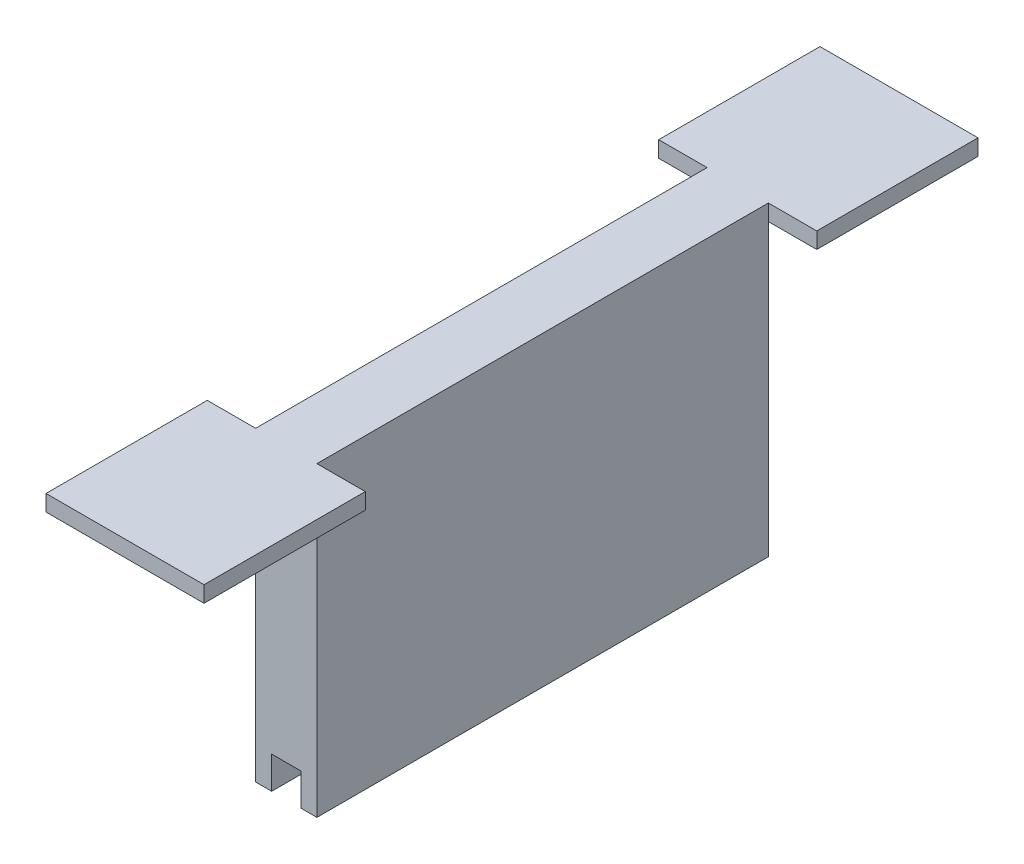
ISO-10303-21;
HEADER;
FILE_DESCRIPTION(('STEP AP214'),'2;1');
FILE_NAME('part.step','',(''),(''),'','','');
FILE_SCHEMA(('AUTOMOTIVE_DESIGN { 1 0 10303 214 1 1 1 1 }'));
ENDSEC;
DATA;
#1=APPLICATION_CONTEXT('core data for automotive mechanical design processes');
#2=APPLICATION_PROTOCOL_DEFINITION('international standard','automotive_design',2000,#1);
#3=PRODUCT_CONTEXT('',#1,'mechanical');
#4=PRODUCT('Part','Part','',(#3));
#5=PRODUCT_RELATED_PRODUCT_CATEGORY('part','',(#4));
#6=PRODUCT_DEFINITION_FORMATION('','',#4);
#7=PRODUCT_DEFINITION_CONTEXT('part definition',#1,'design');
#8=PRODUCT_DEFINITION('design','',#6,#7);
#9=PRODUCT_DEFINITION_SHAPE('','',#8);
#10=(LENGTH_UNIT() NAMED_UNIT(*) SI_UNIT(.MILLI.,.METRE.));
#11=(NAMED_UNIT(*) PLANE_ANGLE_UNIT() SI_UNIT($,.RADIAN.));
#12=(NAMED_UNIT(*) SI_UNIT($,.STERADIAN.) SOLID_ANGLE_UNIT());
#13=UNCERTAINTY_MEASURE_WITH_UNIT(LENGTH_MEASURE(1.E-05),#10,'distance_accuracy_value','');
#14=(GEOMETRIC_REPRESENTATION_CONTEXT(3) GLOBAL_UNCERTAINTY_ASSIGNED_CONTEXT((#13)) GLOBAL_UNIT_ASSIGNED_CONTEXT((#10,
#11,#12)) REPRESENTATION_CONTEXT('',''));
#15=CARTESIAN_POINT('',(0.,0.,0.));
#16=DIRECTION('',(0.,0.,1.));
#17=DIRECTION('',(1.,0.,0.));
#18=AXIS2_PLACEMENT_3D('',#15,#16,#17);
#19=CARTESIAN_POINT('',(3.8,0.,28.));
#20=DIRECTION('',(-1.,0.,0.));
#21=DIRECTION('',(0.,-1.,0.));
#22=AXIS2_PLACEMENT_3D('',#19,#20,#21);
#23=PLANE('',#22);
#24=DIRECTION('',(0.,1.,0.));
#25=VECTOR('',#24,1.);
#26=CARTESIAN_POINT('',(3.8,18.,28.));
#27=LINE('',#26,#25);
#28=CARTESIAN_POINT('',(3.8,18.,28.));
#29=VERTEX_POINT('',#28);
#30=CARTESIAN_POINT('',(3.8,19.,28.));
#31=VERTEX_POINT('',#30);
#32=EDGE_CURVE('E184',#29,#31,#27,.T.);
#33=ORIENTED_EDGE('',*,*,#32,.F.);
#34=DIRECTION('',(0.,1.,0.));
#35=VECTOR('',#34,1.);
#36=CARTESIAN_POINT('',(3.8,0.,28.));
#37=LINE('',#36,#35);
#38=CARTESIAN_POINT('',(3.8,0.,28.));
#39=VERTEX_POINT('',#38);
#40=EDGE_CURVE('E311',#39,#29,#37,.T.);
#41=ORIENTED_EDGE('',*,*,#40,.F.);
#42=DIRECTION('',(0.,0.,-1.));
#43=VECTOR('',#42,1.);
#44=CARTESIAN_POINT('',(3.8,0.,28.));
#45=LINE('',#44,#43);
#46=CARTESIAN_POINT('',(3.8,0.,0.));
#47=VERTEX_POINT('',#46);
#48=EDGE_CURVE('E353',#39,#47,#45,.T.);
#49=ORIENTED_EDGE('',*,*,#48,.T.);
#50=DIRECTION('',(0.,1.,0.));
#51=VECTOR('',#50,1.);
#52=CARTESIAN_POINT('',(3.8,0.,0.));
#53=LINE('',#52,#51);
#54=CARTESIAN_POINT('',(3.8,18.,0.));
#55=VERTEX_POINT('',#54);
#56=EDGE_CURVE('E339',#47,#55,#53,.T.);
#57=ORIENTED_EDGE('',*,*,#56,.T.);
#58=DIRECTION('',(0.,1.,0.));
#59=VECTOR('',#58,1.);
#60=CARTESIAN_POINT('',(3.8,18.,0.));
#61=LINE('',#60,#59);
#62=CARTESIAN_POINT('',(3.8,19.,0.));
#63=VERTEX_POINT('',#62);
#64=EDGE_CURVE('E246',#55,#63,#61,.T.);
#65=ORIENTED_EDGE('',*,*,#64,.T.);
#66=DIRECTION('',(0.,0.,-1.));
#67=VECTOR('',#66,1.);
#68=CARTESIAN_POINT('',(3.8,19.,28.));
#69=LINE('',#68,#67);
#70=EDGE_CURVE('E55',#31,#63,#69,.T.);
#71=ORIENTED_EDGE('',*,*,#70,.F.);
#72=EDGE_LOOP('',(#33,#41,#49,#57,#65,#71));
#73=FACE_BOUND('',#72,.T.);
#74=ADVANCED_FACE('F39',(#73),#23,.F.);
#75=CARTESIAN_POINT('',(0.,0.,28.));
#76=DIRECTION('',(-1.,0.,0.));
#77=DIRECTION('',(0.,0.,1.));
#78=AXIS2_PLACEMENT_3D('',#75,#76,#77);
#79=PLANE('',#78);
#80=DIRECTION('',(0.,1.,0.));
#81=VECTOR('',#80,1.);
#82=CARTESIAN_POINT('',(0.,0.,28.));
#83=LINE('',#82,#81);
#84=CARTESIAN_POINT('',(0.,0.,28.));
#85=VERTEX_POINT('',#84);
#86=CARTESIAN_POINT('',(0.,18.,28.));
#87=VERTEX_POINT('',#86);
#88=EDGE_CURVE('E315',#85,#87,#83,.T.);
#89=ORIENTED_EDGE('',*,*,#88,.T.);
#90=DIRECTION('',(0.,-1.,0.));
#91=VECTOR('',#90,1.);
#92=CARTESIAN_POINT('',(0.,18.,28.));
#93=LINE('',#92,#91);
#94=CARTESIAN_POINT('',(0.,19.,28.));
#95=VERTEX_POINT('',#94);
#96=EDGE_CURVE('E188',#95,#87,#93,.T.);
#97=ORIENTED_EDGE('',*,*,#96,.F.);
#98=DIRECTION('',(0.,0.,-1.));
#99=VECTOR('',#98,1.);
#100=CARTESIAN_POINT('',(0.,19.,28.));
#101=LINE('',#100,#99);
#102=CARTESIAN_POINT('',(0.,19.,0.));
#103=VERTEX_POINT('',#102);
#104=EDGE_CURVE('E348',#95,#103,#101,.T.);
#105=ORIENTED_EDGE('',*,*,#104,.T.);
#106=DIRECTION('',(0.,1.,0.));
#107=VECTOR('',#106,1.);
#108=CARTESIAN_POINT('',(0.,18.,0.));
#109=LINE('',#108,#107);
#110=CARTESIAN_POINT('',(0.,18.,0.));
#111=VERTEX_POINT('',#110);
#112=EDGE_CURVE('E219',#111,#103,#109,.T.);
#113=ORIENTED_EDGE('',*,*,#112,.F.);
#114=DIRECTION('',(0.,1.,0.));
#115=VECTOR('',#114,1.);
#116=CARTESIAN_POINT('',(0.,0.,0.));
#117=LINE('',#116,#115);
#118=CARTESIAN_POINT('',(0.,0.,0.));
#119=VERTEX_POINT('',#118);
#120=EDGE_CURVE('E296',#119,#111,#117,.T.);
#121=ORIENTED_EDGE('',*,*,#120,.F.);
#122=DIRECTION('',(0.,0.,-1.));
#123=VECTOR('',#122,1.);
#124=CARTESIAN_POINT('',(0.,0.,28.));
#125=LINE('',#124,#123);
#126=EDGE_CURVE('E319',#85,#119,#125,.T.);
#127=ORIENTED_EDGE('',*,*,#126,.F.);
#128=EDGE_LOOP('',(#89,#97,#105,#113,#121,#127));
#129=FACE_BOUND('',#128,.T.);
#130=ADVANCED_FACE('F389',(#129),#79,.T.);
#131=CARTESIAN_POINT('',(0.,0.,0.));
#132=DIRECTION('',(0.,0.,1.));
#133=DIRECTION('',(1.,0.,0.));
#134=AXIS2_PLACEMENT_3D('',#131,#132,#133);
#135=PLANE('',#134);
#136=DIRECTION('',(-1.,0.,0.));
#137=VECTOR('',#136,1.);
#138=CARTESIAN_POINT('',(3.8,18.,0.));
#139=LINE('',#138,#137);
#140=EDGE_CURVE('E269',#55,#111,#139,.T.);
#141=ORIENTED_EDGE('',*,*,#140,.F.);
#142=ORIENTED_EDGE('',*,*,#56,.F.);
#143=DIRECTION('',(-1.,0.,0.));
#144=VECTOR('',#143,1.);
#145=CARTESIAN_POINT('',(0.,0.,0.));
#146=LINE('',#145,#144);
#147=CARTESIAN_POINT('',(2.8,0.,0.));
#148=VERTEX_POINT('',#147);
#149=EDGE_CURVE('E335',#47,#148,#146,.T.);
#150=ORIENTED_EDGE('',*,*,#149,.T.);
#151=DIRECTION('',(0.,1.,0.));
#152=VECTOR('',#151,1.);
#153=CARTESIAN_POINT('',(2.8,0.,0.));
#154=LINE('',#153,#152);
#155=CARTESIAN_POINT('',(2.8,2.,0.));
#156=VERTEX_POINT('',#155);
#157=EDGE_CURVE('E331',#148,#156,#154,.T.);
#158=ORIENTED_EDGE('',*,*,#157,.T.);
#159=DIRECTION('',(-1.,0.,0.));
#160=VECTOR('',#159,1.);
#161=CARTESIAN_POINT('',(0.,2.,0.));
#162=LINE('',#161,#160);
#163=CARTESIAN_POINT('',(0.995254582107918,2.,0.));
#164=VERTEX_POINT('',#163);
#165=EDGE_CURVE('E327',#156,#164,#162,.T.);
#166=ORIENTED_EDGE('',*,*,#165,.T.);
#167=DIRECTION('',(0.,1.,0.));
#168=VECTOR('',#167,1.);
#169=CARTESIAN_POINT('',(0.995254582107918,0.,0.));
#170=LINE('',#169,#168);
#171=CARTESIAN_POINT('',(0.995254582107918,0.,0.));
#172=VERTEX_POINT('',#171);
#173=EDGE_CURVE('E323',#172,#164,#170,.T.);
#174=ORIENTED_EDGE('',*,*,#173,.F.);
#175=DIRECTION('',(1.,0.,0.));
#176=VECTOR('',#175,1.);
#177=CARTESIAN_POINT('',(0.,0.,0.));
#178=LINE('',#177,#176);
#179=EDGE_CURVE('E287',#119,#172,#178,.T.);
#180=ORIENTED_EDGE('',*,*,#179,.F.);
#181=ORIENTED_EDGE('',*,*,#120,.T.);
#182=EDGE_LOOP('',(#141,#142,#150,#158,#166,#174,#180,#181));
#183=FACE_BOUND('',#182,.T.);
#184=ADVANCED_FACE('F373',(#183),#135,.F.);
#185=CARTESIAN_POINT('',(0.,0.,28.));
#186=DIRECTION('',(0.,1.,0.));
#187=DIRECTION('',(0.,0.,1.));
#188=AXIS2_PLACEMENT_3D('',#185,#186,#187);
#189=PLANE('',#188);
#190=ORIENTED_EDGE('',*,*,#179,.T.);
#191=DIRECTION('',(0.,0.,-1.));
#192=VECTOR('',#191,1.);
#193=CARTESIAN_POINT('',(0.995254582107918,0.,28.));
#194=LINE('',#193,#192);
#195=CARTESIAN_POINT('',(0.995254582107918,0.,28.));
#196=VERTEX_POINT('',#195);
#197=EDGE_CURVE('E11',#196,#172,#194,.T.);
#198=ORIENTED_EDGE('',*,*,#197,.F.);
#199=DIRECTION('',(1.,0.,0.));
#200=VECTOR('',#199,1.);
#201=CARTESIAN_POINT('',(0.,0.,28.));
#202=LINE('',#201,#200);
#203=EDGE_CURVE('E291',#85,#196,#202,.T.);
#204=ORIENTED_EDGE('',*,*,#203,.F.);
#205=ORIENTED_EDGE('',*,*,#126,.T.);
#206=EDGE_LOOP('',(#190,#198,#204,#205));
#207=FACE_BOUND('',#206,.T.);
#208=ADVANCED_FACE('F41',(#207),#189,.F.);
#209=CARTESIAN_POINT('',(0.995254582107918,0.,28.));
#210=DIRECTION('',(-1.,0.,0.));
#211=DIRECTION('',(0.,0.,1.));
#212=AXIS2_PLACEMENT_3D('',#209,#210,#211);
#213=PLANE('',#212);
#214=ORIENTED_EDGE('',*,*,#173,.T.);
#215=DIRECTION('',(0.,0.,-1.));
#216=VECTOR('',#215,1.);
#217=CARTESIAN_POINT('',(0.995254582107918,2.,28.));
#218=LINE('',#217,#216);
#219=CARTESIAN_POINT('',(0.995254582107918,2.,28.));
#220=VERTEX_POINT('',#219);
#221=EDGE_CURVE('E48',#220,#164,#218,.T.);
#222=ORIENTED_EDGE('',*,*,#221,.F.);
#223=DIRECTION('',(0.,1.,0.));
#224=VECTOR('',#223,1.);
#225=CARTESIAN_POINT('',(0.995254582107918,0.,28.));
#226=LINE('',#225,#224);
#227=EDGE_CURVE('E295',#196,#220,#226,.T.);
#228=ORIENTED_EDGE('',*,*,#227,.F.);
#229=ORIENTED_EDGE('',*,*,#197,.T.);
#230=EDGE_LOOP('',(#214,#222,#228,#229));
#231=FACE_BOUND('',#230,.T.);
#232=ADVANCED_FACE('F368',(#231),#213,.F.);
#233=CARTESIAN_POINT('',(0.,2.,28.));
#234=DIRECTION('',(0.,-1.,0.));
#235=DIRECTION('',(1.,0.,0.));
#236=AXIS2_PLACEMENT_3D('',#233,#234,#235);
#237=PLANE('',#236);
#238=ORIENTED_EDGE('',*,*,#165,.F.);
#239=DIRECTION('',(0.,0.,-1.));
#240=VECTOR('',#239,1.);
#241=CARTESIAN_POINT('',(2.8,2.,28.));
#242=LINE('',#241,#240);
#243=CARTESIAN_POINT('',(2.8,2.,28.));
#244=VERTEX_POINT('',#243);
#245=EDGE_CURVE('E359',#244,#156,#242,.T.);
#246=ORIENTED_EDGE('',*,*,#245,.F.);
#247=DIRECTION('',(-1.,0.,0.));
#248=VECTOR('',#247,1.);
#249=CARTESIAN_POINT('',(0.,2.,28.));
#250=LINE('',#249,#248);
#251=EDGE_CURVE('E299',#244,#220,#250,.T.);
#252=ORIENTED_EDGE('',*,*,#251,.T.);
#253=ORIENTED_EDGE('',*,*,#221,.T.);
#254=EDGE_LOOP('',(#238,#246,#252,#253));
#255=FACE_BOUND('',#254,.T.);
#256=ADVANCED_FACE('F365',(#255),#237,.T.);
#257=CARTESIAN_POINT('',(2.8,0.,28.));
#258=DIRECTION('',(-1.,0.,0.));
#259=DIRECTION('',(0.,0.,1.));
#260=AXIS2_PLACEMENT_3D('',#257,#258,#259);
#261=PLANE('',#260);
#262=ORIENTED_EDGE('',*,*,#157,.F.);
#263=DIRECTION('',(0.,0.,-1.));
#264=VECTOR('',#263,1.);
#265=CARTESIAN_POINT('',(2.8,0.,28.));
#266=LINE('',#265,#264);
#267=CARTESIAN_POINT('',(2.8,0.,28.));
#268=VERTEX_POINT('',#267);
#269=EDGE_CURVE('E356',#268,#148,#266,.T.);
#270=ORIENTED_EDGE('',*,*,#269,.F.);
#271=DIRECTION('',(0.,1.,0.));
#272=VECTOR('',#271,1.);
#273=CARTESIAN_POINT('',(2.8,0.,28.));
#274=LINE('',#273,#272);
#275=EDGE_CURVE('E303',#268,#244,#274,.T.);
#276=ORIENTED_EDGE('',*,*,#275,.T.);
#277=ORIENTED_EDGE('',*,*,#245,.T.);
#278=EDGE_LOOP('',(#262,#270,#276,#277));
#279=FACE_BOUND('',#278,.T.);
#280=ADVANCED_FACE('F378',(#279),#261,.T.);
#281=CARTESIAN_POINT('',(0.,0.,28.));
#282=DIRECTION('',(0.,-1.,0.));
#283=DIRECTION('',(1.,0.,0.));
#284=AXIS2_PLACEMENT_3D('',#281,#282,#283);
#285=PLANE('',#284);
#286=ORIENTED_EDGE('',*,*,#149,.F.);
#287=ORIENTED_EDGE('',*,*,#48,.F.);
#288=DIRECTION('',(-1.,0.,0.));
#289=VECTOR('',#288,1.);
#290=CARTESIAN_POINT('',(0.,0.,28.));
#291=LINE('',#290,#289);
#292=EDGE_CURVE('E307',#39,#268,#291,.T.);
#293=ORIENTED_EDGE('',*,*,#292,.T.);
#294=ORIENTED_EDGE('',*,*,#269,.T.);
#295=EDGE_LOOP('',(#286,#287,#293,#294));
#296=FACE_BOUND('',#295,.T.);
#297=ADVANCED_FACE('F404',(#296),#285,.T.);
#298=CARTESIAN_POINT('',(0.,19.,28.));
#299=DIRECTION('',(0.,1.,0.));
#300=DIRECTION('',(0.,0.,1.));
#301=AXIS2_PLACEMENT_3D('',#298,#299,#300);
#302=PLANE('',#301);
#303=DIRECTION('',(1.,0.,0.));
#304=VECTOR('',#303,1.);
#305=CARTESIAN_POINT('',(0.,19.,38.));
#306=LINE('',#305,#304);
#307=CARTESIAN_POINT('',(-3.,19.,38.));
#308=VERTEX_POINT('',#307);
#309=CARTESIAN_POINT('',(6.8,19.,38.));
#310=VERTEX_POINT('',#309);
#311=EDGE_CURVE('E168',#308,#310,#306,.T.);
#312=ORIENTED_EDGE('',*,*,#311,.T.);
#313=DIRECTION('',(0.,0.,1.));
#314=VECTOR('',#313,1.);
#315=CARTESIAN_POINT('',(6.8,19.,28.));
#316=LINE('',#315,#314);
#317=CARTESIAN_POINT('',(6.8,19.,28.));
#318=VERTEX_POINT('',#317);
#319=EDGE_CURVE('E161',#318,#310,#316,.T.);
#320=ORIENTED_EDGE('',*,*,#319,.F.);
#321=DIRECTION('',(-1.,0.,0.));
#322=VECTOR('',#321,1.);
#323=CARTESIAN_POINT('',(6.8,19.,28.));
#324=LINE('',#323,#322);
#325=EDGE_CURVE('E165',#318,#31,#324,.T.);
#326=ORIENTED_EDGE('',*,*,#325,.T.);
#327=ORIENTED_EDGE('',*,*,#70,.T.);
#328=DIRECTION('',(-1.,0.,0.));
#329=VECTOR('',#328,1.);
#330=CARTESIAN_POINT('',(6.8,19.,0.));
#331=LINE('',#330,#329);
#332=CARTESIAN_POINT('',(6.8,19.,0.));
#333=VERTEX_POINT('',#332);
#334=EDGE_CURVE('E266',#333,#63,#331,.T.);
#335=ORIENTED_EDGE('',*,*,#334,.F.);
#336=DIRECTION('',(0.,0.,-1.));
#337=VECTOR('',#336,1.);
#338=CARTESIAN_POINT('',(6.8,19.,0.));
#339=LINE('',#338,#337);
#340=CARTESIAN_POINT('',(6.8,19.,-10.));
#341=VERTEX_POINT('',#340);
#342=EDGE_CURVE('E247',#333,#341,#339,.T.);
#343=ORIENTED_EDGE('',*,*,#342,.T.);
#344=DIRECTION('',(-1.,0.,0.));
#345=VECTOR('',#344,1.);
#346=CARTESIAN_POINT('',(3.8,19.,-10.));
#347=LINE('',#346,#345);
#348=CARTESIAN_POINT('',(-3.,19.,-10.));
#349=VERTEX_POINT('',#348);
#350=EDGE_CURVE('E275',#341,#349,#347,.T.);
#351=ORIENTED_EDGE('',*,*,#350,.T.);
#352=DIRECTION('',(0.,0.,-1.));
#353=VECTOR('',#352,1.);
#354=CARTESIAN_POINT('',(-3.,19.,0.));
#355=LINE('',#354,#353);
#356=CARTESIAN_POINT('',(-3.,19.,0.));
#357=VERTEX_POINT('',#356);
#358=EDGE_CURVE('E224',#357,#349,#355,.T.);
#359=ORIENTED_EDGE('',*,*,#358,.F.);
#360=DIRECTION('',(1.,0.,0.));
#361=VECTOR('',#360,1.);
#362=CARTESIAN_POINT('',(-3.,19.,0.));
#363=LINE('',#362,#361);
#364=EDGE_CURVE('E242',#357,#103,#363,.T.);
#365=ORIENTED_EDGE('',*,*,#364,.T.);
#366=ORIENTED_EDGE('',*,*,#104,.F.);
#367=DIRECTION('',(1.,0.,0.));
#368=VECTOR('',#367,1.);
#369=CARTESIAN_POINT('',(-3.,19.,28.));
#370=LINE('',#369,#368);
#371=CARTESIAN_POINT('',(-3.,19.,28.));
#372=VERTEX_POINT('',#371);
#373=EDGE_CURVE('E212',#372,#95,#370,.T.);
#374=ORIENTED_EDGE('',*,*,#373,.F.);
#375=DIRECTION('',(0.,0.,-1.));
#376=VECTOR('',#375,1.);
#377=CARTESIAN_POINT('',(-3.,19.,28.));
#378=LINE('',#377,#376);
#379=EDGE_CURVE('E210',#308,#372,#378,.T.);
#380=ORIENTED_EDGE('',*,*,#379,.F.);
#381=EDGE_LOOP('',(#312,#320,#326,#327,#335,#343,#351,#359,#365,#366,#374,#380));
#382=FACE_BOUND('',#381,.T.);
#383=ADVANCED_FACE('F163',(#382),#302,.T.);
#384=CARTESIAN_POINT('',(0.,0.,28.));
#385=DIRECTION('',(0.,0.,1.));
#386=DIRECTION('',(1.,0.,0.));
#387=AXIS2_PLACEMENT_3D('',#384,#385,#386);
#388=PLANE('',#387);
#389=DIRECTION('',(1.,0.,0.));
#390=VECTOR('',#389,1.);
#391=CARTESIAN_POINT('',(0.,18.,28.));
#392=LINE('',#391,#390);
#393=EDGE_CURVE('E278',#87,#29,#392,.T.);
#394=ORIENTED_EDGE('',*,*,#393,.F.);
#395=ORIENTED_EDGE('',*,*,#88,.F.);
#396=ORIENTED_EDGE('',*,*,#203,.T.);
#397=ORIENTED_EDGE('',*,*,#227,.T.);
#398=ORIENTED_EDGE('',*,*,#251,.F.);
#399=ORIENTED_EDGE('',*,*,#275,.F.);
#400=ORIENTED_EDGE('',*,*,#292,.F.);
#401=ORIENTED_EDGE('',*,*,#40,.T.);
#402=EDGE_LOOP('',(#394,#395,#396,#397,#398,#399,#400,#401));
#403=FACE_BOUND('',#402,.T.);
#404=ADVANCED_FACE('F382',(#403),#388,.T.);
#405=CARTESIAN_POINT('',(0.,18.,38.));
#406=DIRECTION('',(0.,1.,0.));
#407=DIRECTION('',(0.,0.,1.));
#408=AXIS2_PLACEMENT_3D('',#405,#406,#407);
#409=PLANE('',#408);
#410=ORIENTED_EDGE('',*,*,#393,.T.);
#411=DIRECTION('',(-1.,0.,0.));
#412=VECTOR('',#411,1.);
#413=CARTESIAN_POINT('',(6.8,18.,28.));
#414=LINE('',#413,#412);
#415=CARTESIAN_POINT('',(6.8,18.,28.));
#416=VERTEX_POINT('',#415);
#417=EDGE_CURVE('E189',#416,#29,#414,.T.);
#418=ORIENTED_EDGE('',*,*,#417,.F.);
#419=DIRECTION('',(0.,0.,-1.));
#420=VECTOR('',#419,1.);
#421=CARTESIAN_POINT('',(6.8,18.,28.));
#422=LINE('',#421,#420);
#423=CARTESIAN_POINT('',(6.8,18.,38.));
#424=VERTEX_POINT('',#423);
#425=EDGE_CURVE('E179',#424,#416,#422,.T.);
#426=ORIENTED_EDGE('',*,*,#425,.F.);
#427=DIRECTION('',(1.,0.,0.));
#428=VECTOR('',#427,1.);
#429=CARTESIAN_POINT('',(0.,18.,38.));
#430=LINE('',#429,#428);
#431=CARTESIAN_POINT('',(-3.,18.,38.));
#432=VERTEX_POINT('',#431);
#433=EDGE_CURVE('E282',#432,#424,#430,.T.);
#434=ORIENTED_EDGE('',*,*,#433,.F.);
#435=DIRECTION('',(0.,0.,1.));
#436=VECTOR('',#435,1.);
#437=CARTESIAN_POINT('',(-3.,18.,28.));
#438=LINE('',#437,#436);
#439=CARTESIAN_POINT('',(-3.,18.,28.));
#440=VERTEX_POINT('',#439);
#441=EDGE_CURVE('E202',#440,#432,#438,.T.);
#442=ORIENTED_EDGE('',*,*,#441,.F.);
#443=DIRECTION('',(1.,0.,0.));
#444=VECTOR('',#443,1.);
#445=CARTESIAN_POINT('',(-3.,18.,28.));
#446=LINE('',#445,#444);
#447=EDGE_CURVE('E216',#440,#87,#446,.T.);
#448=ORIENTED_EDGE('',*,*,#447,.T.);
#449=EDGE_LOOP('',(#410,#418,#426,#434,#442,#448));
#450=FACE_BOUND('',#449,.T.);
#451=ADVANCED_FACE('F406',(#450),#409,.F.);
#452=CARTESIAN_POINT('',(0.,0.,38.));
#453=DIRECTION('',(0.,0.,-1.));
#454=DIRECTION('',(-1.,0.,0.));
#455=AXIS2_PLACEMENT_3D('',#452,#453,#454);
#456=PLANE('',#455);
#457=ORIENTED_EDGE('',*,*,#433,.T.);
#458=DIRECTION('',(0.,-1.,0.));
#459=VECTOR('',#458,1.);
#460=CARTESIAN_POINT('',(6.8,18.,38.));
#461=LINE('',#460,#459);
#462=EDGE_CURVE('E173',#310,#424,#461,.T.);
#463=ORIENTED_EDGE('',*,*,#462,.F.);
#464=ORIENTED_EDGE('',*,*,#311,.F.);
#465=DIRECTION('',(0.,1.,0.));
#466=VECTOR('',#465,1.);
#467=CARTESIAN_POINT('',(-3.,18.,38.));
#468=LINE('',#467,#466);
#469=EDGE_CURVE('E206',#432,#308,#468,.T.);
#470=ORIENTED_EDGE('',*,*,#469,.F.);
#471=EDGE_LOOP('',(#457,#463,#464,#470));
#472=FACE_BOUND('',#471,.T.);
#473=ADVANCED_FACE('F460',(#472),#456,.F.);
#474=CARTESIAN_POINT('',(3.8,18.,-10.));
#475=DIRECTION('',(0.,1.,0.));
#476=DIRECTION('',(0.,0.,1.));
#477=AXIS2_PLACEMENT_3D('',#474,#475,#476);
#478=PLANE('',#477);
#479=ORIENTED_EDGE('',*,*,#140,.T.);
#480=DIRECTION('',(1.,0.,0.));
#481=VECTOR('',#480,1.);
#482=CARTESIAN_POINT('',(-3.,18.,0.));
#483=LINE('',#482,#481);
#484=CARTESIAN_POINT('',(-3.,18.,0.));
#485=VERTEX_POINT('',#484);
#486=EDGE_CURVE('E235',#485,#111,#483,.T.);
#487=ORIENTED_EDGE('',*,*,#486,.F.);
#488=DIRECTION('',(0.,0.,1.));
#489=VECTOR('',#488,1.);
#490=CARTESIAN_POINT('',(-3.,18.,0.));
#491=LINE('',#490,#489);
#492=CARTESIAN_POINT('',(-3.,18.,-10.));
#493=VERTEX_POINT('',#492);
#494=EDGE_CURVE('E232',#493,#485,#491,.T.);
#495=ORIENTED_EDGE('',*,*,#494,.F.);
#496=DIRECTION('',(-1.,0.,0.));
#497=VECTOR('',#496,1.);
#498=CARTESIAN_POINT('',(3.8,18.,-10.));
#499=LINE('',#498,#497);
#500=CARTESIAN_POINT('',(6.8,18.,-10.));
#501=VERTEX_POINT('',#500);
#502=EDGE_CURVE('E272',#501,#493,#499,.T.);
#503=ORIENTED_EDGE('',*,*,#502,.F.);
#504=DIRECTION('',(0.,0.,-1.));
#505=VECTOR('',#504,1.);
#506=CARTESIAN_POINT('',(6.8,18.,0.));
#507=LINE('',#506,#505);
#508=CARTESIAN_POINT('',(6.8,18.,0.));
#509=VERTEX_POINT('',#508);
#510=EDGE_CURVE('E255',#509,#501,#507,.T.);
#511=ORIENTED_EDGE('',*,*,#510,.F.);
#512=DIRECTION('',(-1.,0.,0.));
#513=VECTOR('',#512,1.);
#514=CARTESIAN_POINT('',(6.8,18.,0.));
#515=LINE('',#514,#513);
#516=EDGE_CURVE('E263',#509,#55,#515,.T.);
#517=ORIENTED_EDGE('',*,*,#516,.T.);
#518=EDGE_LOOP('',(#479,#487,#495,#503,#511,#517));
#519=FACE_BOUND('',#518,.T.);
#520=ADVANCED_FACE('F399',(#519),#478,.F.);
#521=CARTESIAN_POINT('',(0.,0.,-10.));
#522=DIRECTION('',(0.,0.,1.));
#523=DIRECTION('',(1.,0.,0.));
#524=AXIS2_PLACEMENT_3D('',#521,#522,#523);
#525=PLANE('',#524);
#526=ORIENTED_EDGE('',*,*,#502,.T.);
#527=DIRECTION('',(0.,-1.,0.));
#528=VECTOR('',#527,1.);
#529=CARTESIAN_POINT('',(-3.,18.,-10.));
#530=LINE('',#529,#528);
#531=EDGE_CURVE('E228',#349,#493,#530,.T.);
#532=ORIENTED_EDGE('',*,*,#531,.F.);
#533=ORIENTED_EDGE('',*,*,#350,.F.);
#534=DIRECTION('',(0.,1.,0.));
#535=VECTOR('',#534,1.);
#536=CARTESIAN_POINT('',(6.8,18.,-10.));
#537=LINE('',#536,#535);
#538=EDGE_CURVE('E251',#501,#341,#537,.T.);
#539=ORIENTED_EDGE('',*,*,#538,.F.);
#540=EDGE_LOOP('',(#526,#532,#533,#539));
#541=FACE_BOUND('',#540,.T.);
#542=ADVANCED_FACE('F416',(#541),#525,.F.);
#543=CARTESIAN_POINT('',(6.8,18.,0.));
#544=DIRECTION('',(0.,0.,1.));
#545=DIRECTION('',(1.,0.,0.));
#546=AXIS2_PLACEMENT_3D('',#543,#544,#545);
#547=PLANE('',#546);
#548=ORIENTED_EDGE('',*,*,#64,.F.);
#549=ORIENTED_EDGE('',*,*,#516,.F.);
#550=DIRECTION('',(0.,1.,0.));
#551=VECTOR('',#550,1.);
#552=CARTESIAN_POINT('',(6.8,18.,0.));
#553=LINE('',#552,#551);
#554=EDGE_CURVE('E259',#509,#333,#553,.T.);
#555=ORIENTED_EDGE('',*,*,#554,.T.);
#556=ORIENTED_EDGE('',*,*,#334,.T.);
#557=EDGE_LOOP('',(#548,#549,#555,#556));
#558=FACE_BOUND('',#557,.T.);
#559=ADVANCED_FACE('F423',(#558),#547,.T.);
#560=CARTESIAN_POINT('',(6.8,0.,0.));
#561=DIRECTION('',(1.,0.,0.));
#562=DIRECTION('',(0.,0.,-1.));
#563=AXIS2_PLACEMENT_3D('',#560,#561,#562);
#564=PLANE('',#563);
#565=ORIENTED_EDGE('',*,*,#342,.F.);
#566=ORIENTED_EDGE('',*,*,#554,.F.);
#567=ORIENTED_EDGE('',*,*,#510,.T.);
#568=ORIENTED_EDGE('',*,*,#538,.T.);
#569=EDGE_LOOP('',(#565,#566,#567,#568));
#570=FACE_BOUND('',#569,.T.);
#571=ADVANCED_FACE('F421',(#570),#564,.T.);
#572=CARTESIAN_POINT('',(-3.,18.,0.));
#573=DIRECTION('',(0.,0.,-1.));
#574=DIRECTION('',(-1.,0.,0.));
#575=AXIS2_PLACEMENT_3D('',#572,#573,#574);
#576=PLANE('',#575);
#577=ORIENTED_EDGE('',*,*,#112,.T.);
#578=ORIENTED_EDGE('',*,*,#364,.F.);
#579=DIRECTION('',(0.,1.,0.));
#580=VECTOR('',#579,1.);
#581=CARTESIAN_POINT('',(-3.,18.,0.));
#582=LINE('',#581,#580);
#583=EDGE_CURVE('E220',#485,#357,#582,.T.);
#584=ORIENTED_EDGE('',*,*,#583,.F.);
#585=ORIENTED_EDGE('',*,*,#486,.T.);
#586=EDGE_LOOP('',(#577,#578,#584,#585));
#587=FACE_BOUND('',#586,.T.);
#588=ADVANCED_FACE('F394',(#587),#576,.F.);
#589=CARTESIAN_POINT('',(-3.,0.,0.));
#590=DIRECTION('',(-1.,0.,0.));
#591=DIRECTION('',(0.,0.,1.));
#592=AXIS2_PLACEMENT_3D('',#589,#590,#591);
#593=PLANE('',#592);
#594=ORIENTED_EDGE('',*,*,#583,.T.);
#595=ORIENTED_EDGE('',*,*,#358,.T.);
#596=ORIENTED_EDGE('',*,*,#531,.T.);
#597=ORIENTED_EDGE('',*,*,#494,.T.);
#598=EDGE_LOOP('',(#594,#595,#596,#597));
#599=FACE_BOUND('',#598,.T.);
#600=ADVANCED_FACE('F414',(#599),#593,.T.);
#601=CARTESIAN_POINT('',(-3.,18.,28.));
#602=DIRECTION('',(0.,0.,1.));
#603=DIRECTION('',(1.,0.,0.));
#604=AXIS2_PLACEMENT_3D('',#601,#602,#603);
#605=PLANE('',#604);
#606=ORIENTED_EDGE('',*,*,#96,.T.);
#607=ORIENTED_EDGE('',*,*,#447,.F.);
#608=DIRECTION('',(0.,-1.,0.));
#609=VECTOR('',#608,1.);
#610=CARTESIAN_POINT('',(-3.,18.,28.));
#611=LINE('',#610,#609);
#612=EDGE_CURVE('E194',#372,#440,#611,.T.);
#613=ORIENTED_EDGE('',*,*,#612,.F.);
#614=ORIENTED_EDGE('',*,*,#373,.T.);
#615=EDGE_LOOP('',(#606,#607,#613,#614));
#616=FACE_BOUND('',#615,.T.);
#617=ADVANCED_FACE('F410',(#616),#605,.F.);
#618=CARTESIAN_POINT('',(-3.,0.,0.));
#619=DIRECTION('',(1.,0.,0.));
#620=DIRECTION('',(0.,0.,-1.));
#621=AXIS2_PLACEMENT_3D('',#618,#619,#620);
#622=PLANE('',#621);
#623=ORIENTED_EDGE('',*,*,#612,.T.);
#624=ORIENTED_EDGE('',*,*,#441,.T.);
#625=ORIENTED_EDGE('',*,*,#469,.T.);
#626=ORIENTED_EDGE('',*,*,#379,.T.);
#627=EDGE_LOOP('',(#623,#624,#625,#626));
#628=FACE_BOUND('',#627,.T.);
#629=ADVANCED_FACE('F508',(#628),#622,.F.);
#630=CARTESIAN_POINT('',(6.8,18.,28.));
#631=DIRECTION('',(0.,0.,1.));
#632=DIRECTION('',(1.,0.,0.));
#633=AXIS2_PLACEMENT_3D('',#630,#631,#632);
#634=PLANE('',#633);
#635=ORIENTED_EDGE('',*,*,#32,.T.);
#636=ORIENTED_EDGE('',*,*,#325,.F.);
#637=DIRECTION('',(0.,1.,0.));
#638=VECTOR('',#637,1.);
#639=CARTESIAN_POINT('',(6.8,18.,28.));
#640=LINE('',#639,#638);
#641=EDGE_CURVE('E174',#416,#318,#640,.T.);
#642=ORIENTED_EDGE('',*,*,#641,.F.);
#643=ORIENTED_EDGE('',*,*,#417,.T.);
#644=EDGE_LOOP('',(#635,#636,#642,#643));
#645=FACE_BOUND('',#644,.T.);
#646=ADVANCED_FACE('F186',(#645),#634,.F.);
#647=CARTESIAN_POINT('',(6.8,0.,0.));
#648=DIRECTION('',(1.,0.,0.));
#649=DIRECTION('',(0.,0.,-1.));
#650=AXIS2_PLACEMENT_3D('',#647,#648,#649);
#651=PLANE('',#650);
#652=ORIENTED_EDGE('',*,*,#641,.T.);
#653=ORIENTED_EDGE('',*,*,#319,.T.);
#654=ORIENTED_EDGE('',*,*,#462,.T.);
#655=ORIENTED_EDGE('',*,*,#425,.T.);
#656=EDGE_LOOP('',(#652,#653,#654,#655));
#657=FACE_BOUND('',#656,.T.);
#658=ADVANCED_FACE('F177',(#657),#651,.T.);
#659=CLOSED_SHELL('',(#74,#130,#184,#208,#232,#256,#280,#297,#383,#404,#451,#473,#520,#542,#559,
#571,#588,#600,#617,#629,#646,#658));
#660=MANIFOLD_SOLID_BREP('B2',#659);
#661=ADVANCED_BREP_SHAPE_REPRESENTATION('',(#18,#660),#14);
#662=SHAPE_DEFINITION_REPRESENTATION(#9,#661);
ENDSEC;
END-ISO-10303-21;
